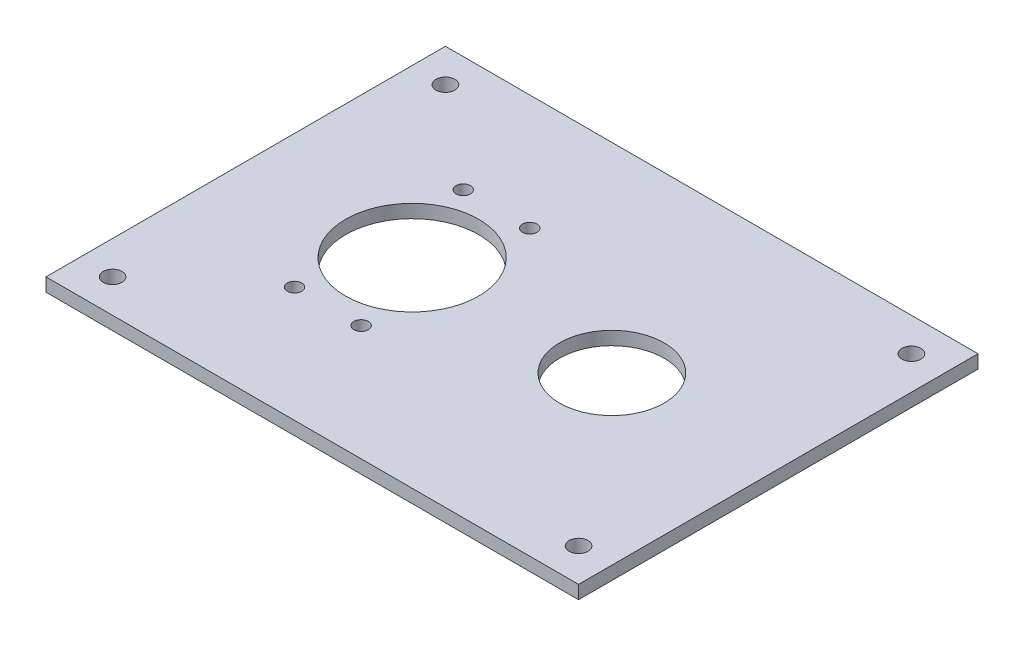
ISO-10303-21;
HEADER;
FILE_DESCRIPTION(('STEP AP214'),'2;1');
FILE_NAME('part.step','',(''),(''),'','','');
FILE_SCHEMA(('AUTOMOTIVE_DESIGN { 1 0 10303 214 1 1 1 1 }'));
ENDSEC;
DATA;
#1=APPLICATION_CONTEXT('core data for automotive mechanical design processes');
#2=APPLICATION_PROTOCOL_DEFINITION('international standard','automotive_design',2000,#1);
#3=PRODUCT_CONTEXT('',#1,'mechanical');
#4=PRODUCT('Part','Part','',(#3));
#5=PRODUCT_RELATED_PRODUCT_CATEGORY('part','',(#4));
#6=PRODUCT_DEFINITION_FORMATION('','',#4);
#7=PRODUCT_DEFINITION_CONTEXT('part definition',#1,'design');
#8=PRODUCT_DEFINITION('design','',#6,#7);
#9=PRODUCT_DEFINITION_SHAPE('','',#8);
#10=(LENGTH_UNIT() NAMED_UNIT(*) SI_UNIT(.MILLI.,.METRE.));
#11=(NAMED_UNIT(*) PLANE_ANGLE_UNIT() SI_UNIT($,.RADIAN.));
#12=(NAMED_UNIT(*) SI_UNIT($,.STERADIAN.) SOLID_ANGLE_UNIT());
#13=UNCERTAINTY_MEASURE_WITH_UNIT(LENGTH_MEASURE(1.E-05),#10,'distance_accuracy_value','');
#14=(GEOMETRIC_REPRESENTATION_CONTEXT(3) GLOBAL_UNCERTAINTY_ASSIGNED_CONTEXT((#13)) GLOBAL_UNIT_ASSIGNED_CONTEXT((#10,
#11,#12)) REPRESENTATION_CONTEXT('',''));
#15=CARTESIAN_POINT('',(0.,0.,0.));
#16=DIRECTION('',(0.,0.,1.));
#17=DIRECTION('',(1.,0.,0.));
#18=AXIS2_PLACEMENT_3D('',#15,#16,#17);
#19=CARTESIAN_POINT('',(0.,6.,0.));
#20=DIRECTION('',(0.,-1.,0.));
#21=DIRECTION('',(0.,0.,-1.));
#22=AXIS2_PLACEMENT_3D('',#19,#20,#21);
#23=PLANE('',#22);
#24=DIRECTION('',(0.,0.,1.));
#25=VECTOR('',#24,1.);
#26=CARTESIAN_POINT('',(-120.,6.,90.));
#27=LINE('',#26,#25);
#28=CARTESIAN_POINT('',(-120.,6.,-90.));
#29=VERTEX_POINT('',#28);
#30=CARTESIAN_POINT('',(-120.,6.,90.));
#31=VERTEX_POINT('',#30);
#32=EDGE_CURVE('E91',#29,#31,#27,.T.);
#33=ORIENTED_EDGE('',*,*,#32,.T.);
#34=DIRECTION('',(1.,0.,0.));
#35=VECTOR('',#34,1.);
#36=CARTESIAN_POINT('',(-120.,6.,90.));
#37=LINE('',#36,#35);
#38=CARTESIAN_POINT('',(120.,6.,90.));
#39=VERTEX_POINT('',#38);
#40=EDGE_CURVE('E86',#31,#39,#37,.T.);
#41=ORIENTED_EDGE('',*,*,#40,.T.);
#42=DIRECTION('',(0.,0.,-1.));
#43=VECTOR('',#42,1.);
#44=CARTESIAN_POINT('',(120.,6.,90.));
#45=LINE('',#44,#43);
#46=CARTESIAN_POINT('',(120.,6.,-90.));
#47=VERTEX_POINT('',#46);
#48=EDGE_CURVE('E87',#39,#47,#45,.T.);
#49=ORIENTED_EDGE('',*,*,#48,.T.);
#50=DIRECTION('',(-1.,0.,0.));
#51=VECTOR('',#50,1.);
#52=CARTESIAN_POINT('',(-120.,6.,-90.));
#53=LINE('',#52,#51);
#54=EDGE_CURVE('E57',#47,#29,#53,.T.);
#55=ORIENTED_EDGE('',*,*,#54,.T.);
#56=EDGE_LOOP('',(#33,#41,#49,#55));
#57=FACE_BOUND('',#56,.T.);
#58=CARTESIAN_POINT('',(45.,6.,0.));
#59=DIRECTION('',(0.,1.,0.));
#60=DIRECTION('',(0.,0.,1.));
#61=AXIS2_PLACEMENT_3D('',#58,#59,#60);
#62=CIRCLE('',#61,23.55);
#63=CARTESIAN_POINT('',(45.,6.,23.55));
#64=VERTEX_POINT('',#63);
#65=EDGE_CURVE('E106',#64,#64,#62,.T.);
#66=ORIENTED_EDGE('',*,*,#65,.F.);
#67=EDGE_LOOP('',(#66));
#68=FACE_BOUND('',#67,.T.);
#69=CARTESIAN_POINT('',(-45.,6.,0.));
#70=DIRECTION('',(0.,1.,0.));
#71=DIRECTION('',(0.,0.,1.));
#72=AXIS2_PLACEMENT_3D('',#69,#70,#71);
#73=CIRCLE('',#72,30.);
#74=CARTESIAN_POINT('',(-45.,6.,30.));
#75=VERTEX_POINT('',#74);
#76=EDGE_CURVE('E123',#75,#75,#73,.T.);
#77=ORIENTED_EDGE('',*,*,#76,.F.);
#78=EDGE_LOOP('',(#77));
#79=FACE_BOUND('',#78,.T.);
#80=CARTESIAN_POINT('',(-105.,6.,75.));
#81=DIRECTION('',(0.,1.,0.));
#82=DIRECTION('',(0.,0.,1.));
#83=AXIS2_PLACEMENT_3D('',#80,#81,#82);
#84=CIRCLE('',#83,4.25000000000001);
#85=CARTESIAN_POINT('',(-105.,6.,79.25));
#86=VERTEX_POINT('',#85);
#87=EDGE_CURVE('E130',#86,#86,#84,.T.);
#88=ORIENTED_EDGE('',*,*,#87,.F.);
#89=EDGE_LOOP('',(#88));
#90=FACE_BOUND('',#89,.T.);
#91=CARTESIAN_POINT('',(105.,6.,75.));
#92=DIRECTION('',(0.,1.,0.));
#93=DIRECTION('',(0.,0.,1.));
#94=AXIS2_PLACEMENT_3D('',#91,#92,#93);
#95=CIRCLE('',#94,4.25000000000001);
#96=CARTESIAN_POINT('',(105.,6.,79.25));
#97=VERTEX_POINT('',#96);
#98=EDGE_CURVE('E133',#97,#97,#95,.T.);
#99=ORIENTED_EDGE('',*,*,#98,.F.);
#100=EDGE_LOOP('',(#99));
#101=FACE_BOUND('',#100,.T.);
#102=CARTESIAN_POINT('',(-105.,6.,-75.));
#103=DIRECTION('',(0.,1.,0.));
#104=DIRECTION('',(0.,0.,1.));
#105=AXIS2_PLACEMENT_3D('',#102,#103,#104);
#106=CIRCLE('',#105,4.25000000000001);
#107=CARTESIAN_POINT('',(-105.,6.,-70.75));
#108=VERTEX_POINT('',#107);
#109=EDGE_CURVE('E137',#108,#108,#106,.T.);
#110=ORIENTED_EDGE('',*,*,#109,.F.);
#111=EDGE_LOOP('',(#110));
#112=FACE_BOUND('',#111,.T.);
#113=CARTESIAN_POINT('',(105.,6.,-75.));
#114=DIRECTION('',(0.,1.,0.));
#115=DIRECTION('',(0.,0.,1.));
#116=AXIS2_PLACEMENT_3D('',#113,#114,#115);
#117=CIRCLE('',#116,4.25000000000001);
#118=CARTESIAN_POINT('',(105.,6.,-70.75));
#119=VERTEX_POINT('',#118);
#120=EDGE_CURVE('E144',#119,#119,#117,.T.);
#121=ORIENTED_EDGE('',*,*,#120,.F.);
#122=EDGE_LOOP('',(#121));
#123=FACE_BOUND('',#122,.T.);
#124=CARTESIAN_POINT('',(-60.,6.,38.));
#125=DIRECTION('',(0.,1.,0.));
#126=DIRECTION('',(0.,0.,1.));
#127=AXIS2_PLACEMENT_3D('',#124,#125,#126);
#128=CIRCLE('',#127,3.25);
#129=CARTESIAN_POINT('',(-60.,6.,41.25));
#130=VERTEX_POINT('',#129);
#131=EDGE_CURVE('E151',#130,#130,#128,.T.);
#132=ORIENTED_EDGE('',*,*,#131,.F.);
#133=EDGE_LOOP('',(#132));
#134=FACE_BOUND('',#133,.T.);
#135=CARTESIAN_POINT('',(-60.,6.,-38.));
#136=DIRECTION('',(0.,1.,0.));
#137=DIRECTION('',(0.,0.,1.));
#138=AXIS2_PLACEMENT_3D('',#135,#136,#137);
#139=CIRCLE('',#138,3.25);
#140=CARTESIAN_POINT('',(-60.,6.,-34.75));
#141=VERTEX_POINT('',#140);
#142=EDGE_CURVE('E160',#141,#141,#139,.T.);
#143=ORIENTED_EDGE('',*,*,#142,.F.);
#144=EDGE_LOOP('',(#143));
#145=FACE_BOUND('',#144,.T.);
#146=CARTESIAN_POINT('',(-30.,6.,38.));
#147=DIRECTION('',(0.,1.,0.));
#148=DIRECTION('',(0.,0.,1.));
#149=AXIS2_PLACEMENT_3D('',#146,#147,#148);
#150=CIRCLE('',#149,3.25);
#151=CARTESIAN_POINT('',(-30.,6.,41.25));
#152=VERTEX_POINT('',#151);
#153=EDGE_CURVE('E164',#152,#152,#150,.T.);
#154=ORIENTED_EDGE('',*,*,#153,.F.);
#155=EDGE_LOOP('',(#154));
#156=FACE_BOUND('',#155,.T.);
#157=CARTESIAN_POINT('',(-30.,6.,-38.));
#158=DIRECTION('',(0.,1.,0.));
#159=DIRECTION('',(0.,0.,1.));
#160=AXIS2_PLACEMENT_3D('',#157,#158,#159);
#161=CIRCLE('',#160,3.25);
#162=CARTESIAN_POINT('',(-30.,6.,-34.75));
#163=VERTEX_POINT('',#162);
#164=EDGE_CURVE('E170',#163,#163,#161,.T.);
#165=ORIENTED_EDGE('',*,*,#164,.F.);
#166=EDGE_LOOP('',(#165));
#167=FACE_BOUND('',#166,.T.);
#168=ADVANCED_FACE('F39',(#57,#68,#79,#90,#101,#112,#123,#134,#145,#156,#167),#23,.F.);
#169=CARTESIAN_POINT('',(0.,0.,0.));
#170=DIRECTION('',(0.,-1.,0.));
#171=DIRECTION('',(0.,0.,-1.));
#172=AXIS2_PLACEMENT_3D('',#169,#170,#171);
#173=PLANE('',#172);
#174=CARTESIAN_POINT('',(-30.,0.,38.));
#175=DIRECTION('',(0.,1.,0.));
#176=DIRECTION('',(0.,0.,1.));
#177=AXIS2_PLACEMENT_3D('',#174,#175,#176);
#178=CIRCLE('',#177,3.25);
#179=CARTESIAN_POINT('',(-30.,0.,41.25));
#180=VERTEX_POINT('',#179);
#181=EDGE_CURVE('E168',#180,#180,#178,.T.);
#182=ORIENTED_EDGE('',*,*,#181,.T.);
#183=EDGE_LOOP('',(#182));
#184=FACE_BOUND('',#183,.T.);
#185=CARTESIAN_POINT('',(-60.,0.,38.));
#186=DIRECTION('',(0.,1.,0.));
#187=DIRECTION('',(0.,0.,1.));
#188=AXIS2_PLACEMENT_3D('',#185,#186,#187);
#189=CIRCLE('',#188,3.25);
#190=CARTESIAN_POINT('',(-60.,0.,41.25));
#191=VERTEX_POINT('',#190);
#192=EDGE_CURVE('E153',#191,#191,#189,.T.);
#193=ORIENTED_EDGE('',*,*,#192,.T.);
#194=EDGE_LOOP('',(#193));
#195=FACE_BOUND('',#194,.T.);
#196=CARTESIAN_POINT('',(-105.,0.,-75.));
#197=DIRECTION('',(0.,1.,0.));
#198=DIRECTION('',(0.,0.,1.));
#199=AXIS2_PLACEMENT_3D('',#196,#197,#198);
#200=CIRCLE('',#199,4.25000000000001);
#201=CARTESIAN_POINT('',(-105.,0.,-70.75));
#202=VERTEX_POINT('',#201);
#203=EDGE_CURVE('E145',#202,#202,#200,.T.);
#204=ORIENTED_EDGE('',*,*,#203,.T.);
#205=EDGE_LOOP('',(#204));
#206=FACE_BOUND('',#205,.T.);
#207=CARTESIAN_POINT('',(-105.,0.,75.));
#208=DIRECTION('',(0.,1.,0.));
#209=DIRECTION('',(0.,0.,1.));
#210=AXIS2_PLACEMENT_3D('',#207,#208,#209);
#211=CIRCLE('',#210,4.25000000000001);
#212=CARTESIAN_POINT('',(-105.,0.,79.25));
#213=VERTEX_POINT('',#212);
#214=EDGE_CURVE('E127',#213,#213,#211,.T.);
#215=ORIENTED_EDGE('',*,*,#214,.T.);
#216=EDGE_LOOP('',(#215));
#217=FACE_BOUND('',#216,.T.);
#218=CARTESIAN_POINT('',(45.,0.,0.));
#219=DIRECTION('',(0.,1.,0.));
#220=DIRECTION('',(0.,0.,1.));
#221=AXIS2_PLACEMENT_3D('',#218,#219,#220);
#222=CIRCLE('',#221,23.55);
#223=CARTESIAN_POINT('',(45.,0.,23.55));
#224=VERTEX_POINT('',#223);
#225=EDGE_CURVE('E119',#224,#224,#222,.T.);
#226=ORIENTED_EDGE('',*,*,#225,.T.);
#227=EDGE_LOOP('',(#226));
#228=FACE_BOUND('',#227,.T.);
#229=DIRECTION('',(0.,0.,1.));
#230=VECTOR('',#229,1.);
#231=CARTESIAN_POINT('',(-120.,0.,90.));
#232=LINE('',#231,#230);
#233=CARTESIAN_POINT('',(-120.,0.,-90.));
#234=VERTEX_POINT('',#233);
#235=CARTESIAN_POINT('',(-120.,0.,90.));
#236=VERTEX_POINT('',#235);
#237=EDGE_CURVE('E104',#234,#236,#232,.T.);
#238=ORIENTED_EDGE('',*,*,#237,.F.);
#239=DIRECTION('',(-1.,0.,0.));
#240=VECTOR('',#239,1.);
#241=CARTESIAN_POINT('',(-120.,0.,-90.));
#242=LINE('',#241,#240);
#243=CARTESIAN_POINT('',(120.,0.,-90.));
#244=VERTEX_POINT('',#243);
#245=EDGE_CURVE('E80',#244,#234,#242,.T.);
#246=ORIENTED_EDGE('',*,*,#245,.F.);
#247=DIRECTION('',(0.,0.,-1.));
#248=VECTOR('',#247,1.);
#249=CARTESIAN_POINT('',(120.,0.,90.));
#250=LINE('',#249,#248);
#251=CARTESIAN_POINT('',(120.,0.,90.));
#252=VERTEX_POINT('',#251);
#253=EDGE_CURVE('E74',#252,#244,#250,.T.);
#254=ORIENTED_EDGE('',*,*,#253,.F.);
#255=DIRECTION('',(1.,0.,0.));
#256=VECTOR('',#255,1.);
#257=CARTESIAN_POINT('',(-120.,0.,90.));
#258=LINE('',#257,#256);
#259=EDGE_CURVE('E94',#236,#252,#258,.T.);
#260=ORIENTED_EDGE('',*,*,#259,.F.);
#261=EDGE_LOOP('',(#238,#246,#254,#260));
#262=FACE_BOUND('',#261,.T.);
#263=CARTESIAN_POINT('',(-45.,0.,0.));
#264=DIRECTION('',(0.,1.,0.));
#265=DIRECTION('',(0.,0.,1.));
#266=AXIS2_PLACEMENT_3D('',#263,#264,#265);
#267=CIRCLE('',#266,30.);
#268=CARTESIAN_POINT('',(-45.,0.,30.));
#269=VERTEX_POINT('',#268);
#270=EDGE_CURVE('E125',#269,#269,#267,.T.);
#271=ORIENTED_EDGE('',*,*,#270,.T.);
#272=EDGE_LOOP('',(#271));
#273=FACE_BOUND('',#272,.T.);
#274=CARTESIAN_POINT('',(105.,0.,75.));
#275=DIRECTION('',(0.,1.,0.));
#276=DIRECTION('',(0.,0.,1.));
#277=AXIS2_PLACEMENT_3D('',#274,#275,#276);
#278=CIRCLE('',#277,4.25000000000001);
#279=CARTESIAN_POINT('',(105.,0.,79.25));
#280=VERTEX_POINT('',#279);
#281=EDGE_CURVE('E136',#280,#280,#278,.T.);
#282=ORIENTED_EDGE('',*,*,#281,.T.);
#283=EDGE_LOOP('',(#282));
#284=FACE_BOUND('',#283,.T.);
#285=CARTESIAN_POINT('',(105.,0.,-75.));
#286=DIRECTION('',(0.,1.,0.));
#287=DIRECTION('',(0.,0.,1.));
#288=AXIS2_PLACEMENT_3D('',#285,#286,#287);
#289=CIRCLE('',#288,4.25000000000001);
#290=CARTESIAN_POINT('',(105.,0.,-70.75));
#291=VERTEX_POINT('',#290);
#292=EDGE_CURVE('E149',#291,#291,#289,.T.);
#293=ORIENTED_EDGE('',*,*,#292,.T.);
#294=EDGE_LOOP('',(#293));
#295=FACE_BOUND('',#294,.T.);
#296=CARTESIAN_POINT('',(-60.,0.,-38.));
#297=DIRECTION('',(0.,1.,0.));
#298=DIRECTION('',(0.,0.,1.));
#299=AXIS2_PLACEMENT_3D('',#296,#297,#298);
#300=CIRCLE('',#299,3.25);
#301=CARTESIAN_POINT('',(-60.,0.,-34.75));
#302=VERTEX_POINT('',#301);
#303=EDGE_CURVE('E158',#302,#302,#300,.T.);
#304=ORIENTED_EDGE('',*,*,#303,.T.);
#305=EDGE_LOOP('',(#304));
#306=FACE_BOUND('',#305,.T.);
#307=CARTESIAN_POINT('',(-30.,0.,-38.));
#308=DIRECTION('',(0.,1.,0.));
#309=DIRECTION('',(0.,0.,1.));
#310=AXIS2_PLACEMENT_3D('',#307,#308,#309);
#311=CIRCLE('',#310,3.25);
#312=CARTESIAN_POINT('',(-30.,0.,-34.75));
#313=VERTEX_POINT('',#312);
#314=EDGE_CURVE('E175',#313,#313,#311,.T.);
#315=ORIENTED_EDGE('',*,*,#314,.T.);
#316=EDGE_LOOP('',(#315));
#317=FACE_BOUND('',#316,.T.);
#318=ADVANCED_FACE('F114',(#184,#195,#206,#217,#228,#262,#273,#284,#295,#306,#317),#173,.T.);
#319=CARTESIAN_POINT('',(-120.,6.,90.));
#320=DIRECTION('',(1.,0.,0.));
#321=DIRECTION('',(0.,0.,-1.));
#322=AXIS2_PLACEMENT_3D('',#319,#320,#321);
#323=PLANE('',#322);
#324=ORIENTED_EDGE('',*,*,#237,.T.);
#325=DIRECTION('',(0.,-1.,0.));
#326=VECTOR('',#325,1.);
#327=CARTESIAN_POINT('',(-120.,6.,90.));
#328=LINE('',#327,#326);
#329=EDGE_CURVE('E11',#31,#236,#328,.T.);
#330=ORIENTED_EDGE('',*,*,#329,.F.);
#331=ORIENTED_EDGE('',*,*,#32,.F.);
#332=DIRECTION('',(0.,-1.,0.));
#333=VECTOR('',#332,1.);
#334=CARTESIAN_POINT('',(-120.,6.,-90.));
#335=LINE('',#334,#333);
#336=EDGE_CURVE('E98',#29,#234,#335,.T.);
#337=ORIENTED_EDGE('',*,*,#336,.T.);
#338=EDGE_LOOP('',(#324,#330,#331,#337));
#339=FACE_BOUND('',#338,.T.);
#340=ADVANCED_FACE('F41',(#339),#323,.F.);
#341=CARTESIAN_POINT('',(-120.,6.,90.));
#342=DIRECTION('',(0.,0.,-1.));
#343=DIRECTION('',(-1.,0.,0.));
#344=AXIS2_PLACEMENT_3D('',#341,#342,#343);
#345=PLANE('',#344);
#346=ORIENTED_EDGE('',*,*,#259,.T.);
#347=DIRECTION('',(0.,-1.,0.));
#348=VECTOR('',#347,1.);
#349=CARTESIAN_POINT('',(120.,6.,90.));
#350=LINE('',#349,#348);
#351=EDGE_CURVE('E48',#39,#252,#350,.T.);
#352=ORIENTED_EDGE('',*,*,#351,.F.);
#353=ORIENTED_EDGE('',*,*,#40,.F.);
#354=ORIENTED_EDGE('',*,*,#329,.T.);
#355=EDGE_LOOP('',(#346,#352,#353,#354));
#356=FACE_BOUND('',#355,.T.);
#357=ADVANCED_FACE('F92',(#356),#345,.F.);
#358=CARTESIAN_POINT('',(120.,6.,90.));
#359=DIRECTION('',(-1.,0.,0.));
#360=DIRECTION('',(0.,0.,1.));
#361=AXIS2_PLACEMENT_3D('',#358,#359,#360);
#362=PLANE('',#361);
#363=ORIENTED_EDGE('',*,*,#253,.T.);
#364=DIRECTION('',(0.,-1.,0.));
#365=VECTOR('',#364,1.);
#366=CARTESIAN_POINT('',(120.,6.,-90.));
#367=LINE('',#366,#365);
#368=EDGE_CURVE('E96',#47,#244,#367,.T.);
#369=ORIENTED_EDGE('',*,*,#368,.F.);
#370=ORIENTED_EDGE('',*,*,#48,.F.);
#371=ORIENTED_EDGE('',*,*,#351,.T.);
#372=EDGE_LOOP('',(#363,#369,#370,#371));
#373=FACE_BOUND('',#372,.T.);
#374=ADVANCED_FACE('F100',(#373),#362,.F.);
#375=CARTESIAN_POINT('',(-120.,6.,-90.));
#376=DIRECTION('',(0.,0.,1.));
#377=DIRECTION('',(1.,0.,0.));
#378=AXIS2_PLACEMENT_3D('',#375,#376,#377);
#379=PLANE('',#378);
#380=ORIENTED_EDGE('',*,*,#245,.T.);
#381=ORIENTED_EDGE('',*,*,#336,.F.);
#382=ORIENTED_EDGE('',*,*,#54,.F.);
#383=ORIENTED_EDGE('',*,*,#368,.T.);
#384=EDGE_LOOP('',(#380,#381,#382,#383));
#385=FACE_BOUND('',#384,.T.);
#386=ADVANCED_FACE('F112',(#385),#379,.F.);
#387=CARTESIAN_POINT('',(45.,6.,0.));
#388=DIRECTION('',(0.,-1.,0.));
#389=DIRECTION('',(0.,0.,-1.));
#390=AXIS2_PLACEMENT_3D('',#387,#388,#389);
#391=CYLINDRICAL_SURFACE('',#390,23.55);
#392=ORIENTED_EDGE('',*,*,#65,.T.);
#393=EDGE_LOOP('',(#392));
#394=FACE_BOUND('',#393,.T.);
#395=ORIENTED_EDGE('',*,*,#225,.F.);
#396=EDGE_LOOP('',(#395));
#397=FACE_BOUND('',#396,.T.);
#398=ADVANCED_FACE('F188',(#394,#397),#391,.F.);
#399=CARTESIAN_POINT('',(-45.,6.,0.));
#400=DIRECTION('',(0.,-1.,0.));
#401=DIRECTION('',(0.,0.,-1.));
#402=AXIS2_PLACEMENT_3D('',#399,#400,#401);
#403=CYLINDRICAL_SURFACE('',#402,30.);
#404=ORIENTED_EDGE('',*,*,#76,.T.);
#405=EDGE_LOOP('',(#404));
#406=FACE_BOUND('',#405,.T.);
#407=ORIENTED_EDGE('',*,*,#270,.F.);
#408=EDGE_LOOP('',(#407));
#409=FACE_BOUND('',#408,.T.);
#410=ADVANCED_FACE('F233',(#406,#409),#403,.F.);
#411=CARTESIAN_POINT('',(-105.,6.,75.));
#412=DIRECTION('',(0.,-1.,0.));
#413=DIRECTION('',(0.,0.,-1.));
#414=AXIS2_PLACEMENT_3D('',#411,#412,#413);
#415=CYLINDRICAL_SURFACE('',#414,4.25000000000001);
#416=ORIENTED_EDGE('',*,*,#87,.T.);
#417=EDGE_LOOP('',(#416));
#418=FACE_BOUND('',#417,.T.);
#419=ORIENTED_EDGE('',*,*,#214,.F.);
#420=EDGE_LOOP('',(#419));
#421=FACE_BOUND('',#420,.T.);
#422=ADVANCED_FACE('F242',(#418,#421),#415,.F.);
#423=CARTESIAN_POINT('',(105.,6.,75.));
#424=DIRECTION('',(0.,-1.,0.));
#425=DIRECTION('',(0.,0.,-1.));
#426=AXIS2_PLACEMENT_3D('',#423,#424,#425);
#427=CYLINDRICAL_SURFACE('',#426,4.25000000000001);
#428=ORIENTED_EDGE('',*,*,#98,.T.);
#429=EDGE_LOOP('',(#428));
#430=FACE_BOUND('',#429,.T.);
#431=ORIENTED_EDGE('',*,*,#281,.F.);
#432=EDGE_LOOP('',(#431));
#433=FACE_BOUND('',#432,.T.);
#434=ADVANCED_FACE('F248',(#430,#433),#427,.F.);
#435=CARTESIAN_POINT('',(-105.,6.,-75.));
#436=DIRECTION('',(0.,-1.,0.));
#437=DIRECTION('',(0.,0.,-1.));
#438=AXIS2_PLACEMENT_3D('',#435,#436,#437);
#439=CYLINDRICAL_SURFACE('',#438,4.25000000000001);
#440=ORIENTED_EDGE('',*,*,#109,.T.);
#441=EDGE_LOOP('',(#440));
#442=FACE_BOUND('',#441,.T.);
#443=ORIENTED_EDGE('',*,*,#203,.F.);
#444=EDGE_LOOP('',(#443));
#445=FACE_BOUND('',#444,.T.);
#446=ADVANCED_FACE('F260',(#442,#445),#439,.F.);
#447=CARTESIAN_POINT('',(105.,6.,-75.));
#448=DIRECTION('',(0.,-1.,0.));
#449=DIRECTION('',(0.,0.,-1.));
#450=AXIS2_PLACEMENT_3D('',#447,#448,#449);
#451=CYLINDRICAL_SURFACE('',#450,4.25000000000001);
#452=ORIENTED_EDGE('',*,*,#120,.T.);
#453=EDGE_LOOP('',(#452));
#454=FACE_BOUND('',#453,.T.);
#455=ORIENTED_EDGE('',*,*,#292,.F.);
#456=EDGE_LOOP('',(#455));
#457=FACE_BOUND('',#456,.T.);
#458=ADVANCED_FACE('F268',(#454,#457),#451,.F.);
#459=CARTESIAN_POINT('',(-60.,6.,38.));
#460=DIRECTION('',(0.,-1.,0.));
#461=DIRECTION('',(0.,0.,-1.));
#462=AXIS2_PLACEMENT_3D('',#459,#460,#461);
#463=CYLINDRICAL_SURFACE('',#462,3.25);
#464=ORIENTED_EDGE('',*,*,#131,.T.);
#465=EDGE_LOOP('',(#464));
#466=FACE_BOUND('',#465,.T.);
#467=ORIENTED_EDGE('',*,*,#192,.F.);
#468=EDGE_LOOP('',(#467));
#469=FACE_BOUND('',#468,.T.);
#470=ADVANCED_FACE('F280',(#466,#469),#463,.F.);
#471=CARTESIAN_POINT('',(-60.,6.,-38.));
#472=DIRECTION('',(0.,-1.,0.));
#473=DIRECTION('',(0.,0.,-1.));
#474=AXIS2_PLACEMENT_3D('',#471,#472,#473);
#475=CYLINDRICAL_SURFACE('',#474,3.25);
#476=ORIENTED_EDGE('',*,*,#142,.T.);
#477=EDGE_LOOP('',(#476));
#478=FACE_BOUND('',#477,.T.);
#479=ORIENTED_EDGE('',*,*,#303,.F.);
#480=EDGE_LOOP('',(#479));
#481=FACE_BOUND('',#480,.T.);
#482=ADVANCED_FACE('F286',(#478,#481),#475,.F.);
#483=CARTESIAN_POINT('',(-30.,6.,38.));
#484=DIRECTION('',(0.,-1.,0.));
#485=DIRECTION('',(0.,0.,-1.));
#486=AXIS2_PLACEMENT_3D('',#483,#484,#485);
#487=CYLINDRICAL_SURFACE('',#486,3.25);
#488=ORIENTED_EDGE('',*,*,#153,.T.);
#489=EDGE_LOOP('',(#488));
#490=FACE_BOUND('',#489,.T.);
#491=ORIENTED_EDGE('',*,*,#181,.F.);
#492=EDGE_LOOP('',(#491));
#493=FACE_BOUND('',#492,.T.);
#494=ADVANCED_FACE('F293',(#490,#493),#487,.F.);
#495=CARTESIAN_POINT('',(-30.,6.,-38.));
#496=DIRECTION('',(0.,-1.,0.));
#497=DIRECTION('',(0.,0.,-1.));
#498=AXIS2_PLACEMENT_3D('',#495,#496,#497);
#499=CYLINDRICAL_SURFACE('',#498,3.25);
#500=ORIENTED_EDGE('',*,*,#164,.T.);
#501=EDGE_LOOP('',(#500));
#502=FACE_BOUND('',#501,.T.);
#503=ORIENTED_EDGE('',*,*,#314,.F.);
#504=EDGE_LOOP('',(#503));
#505=FACE_BOUND('',#504,.T.);
#506=ADVANCED_FACE('F178',(#502,#505),#499,.F.);
#507=CLOSED_SHELL('',(#168,#318,#340,#357,#374,#386,#398,#410,#422,#434,#446,#458,#470,#482,
#494,#506));
#508=MANIFOLD_SOLID_BREP('B2',#507);
#509=ADVANCED_BREP_SHAPE_REPRESENTATION('',(#18,#508),#14);
#510=SHAPE_DEFINITION_REPRESENTATION(#9,#509);
ENDSEC;
END-ISO-10303-21;
